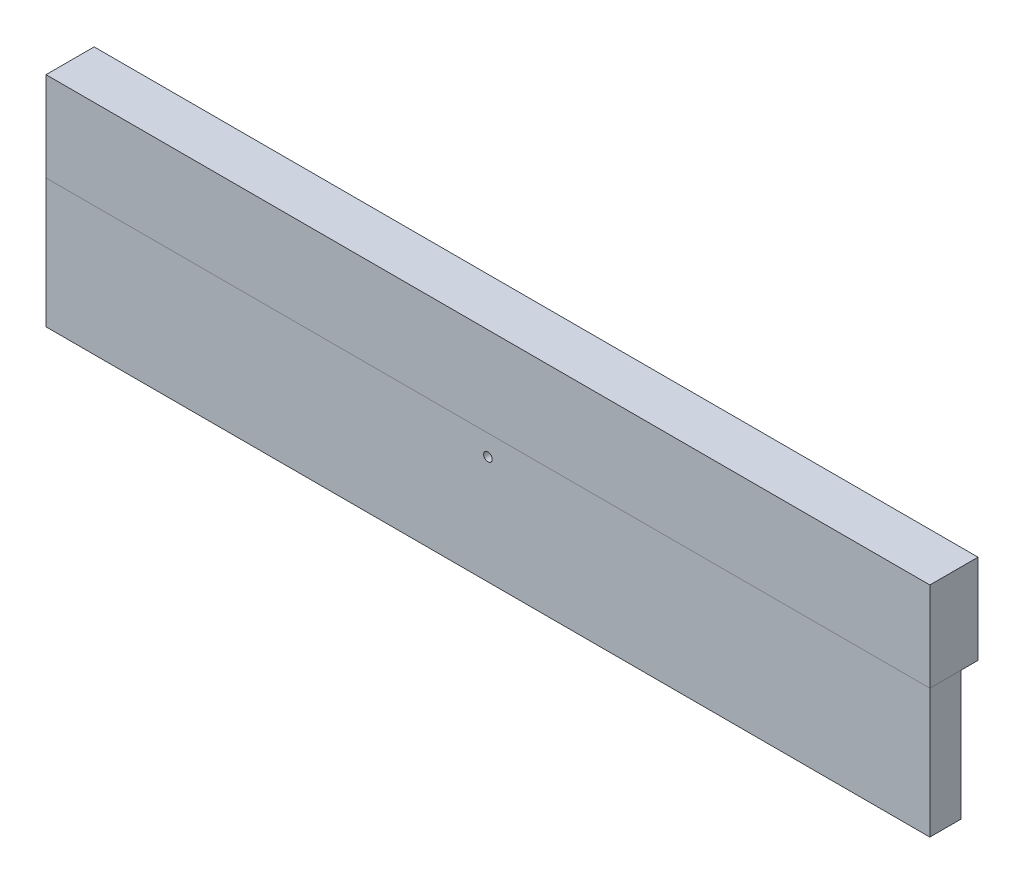
ISO-10303-21;
HEADER;
FILE_DESCRIPTION(('STEP AP214'),'2;1');
FILE_NAME('part.step','',(''),(''),'','','');
FILE_SCHEMA(('AUTOMOTIVE_DESIGN { 1 0 10303 214 1 1 1 1 }'));
ENDSEC;
DATA;
#1=APPLICATION_CONTEXT('core data for automotive mechanical design processes');
#2=APPLICATION_PROTOCOL_DEFINITION('international standard','automotive_design',2000,#1);
#3=PRODUCT_CONTEXT('',#1,'mechanical');
#4=PRODUCT('Part','Part','',(#3));
#5=PRODUCT_RELATED_PRODUCT_CATEGORY('part','',(#4));
#6=PRODUCT_DEFINITION_FORMATION('','',#4);
#7=PRODUCT_DEFINITION_CONTEXT('part definition',#1,'design');
#8=PRODUCT_DEFINITION('design','',#6,#7);
#9=PRODUCT_DEFINITION_SHAPE('','',#8);
#10=(LENGTH_UNIT() NAMED_UNIT(*) SI_UNIT(.MILLI.,.METRE.));
#11=(NAMED_UNIT(*) PLANE_ANGLE_UNIT() SI_UNIT($,.RADIAN.));
#12=(NAMED_UNIT(*) SI_UNIT($,.STERADIAN.) SOLID_ANGLE_UNIT());
#13=UNCERTAINTY_MEASURE_WITH_UNIT(LENGTH_MEASURE(1.E-05),#10,'distance_accuracy_value','');
#14=(GEOMETRIC_REPRESENTATION_CONTEXT(3) GLOBAL_UNCERTAINTY_ASSIGNED_CONTEXT((#13)) GLOBAL_UNIT_ASSIGNED_CONTEXT((#10,
#11,#12)) REPRESENTATION_CONTEXT('',''));
#15=CARTESIAN_POINT('',(0.,0.,0.));
#16=DIRECTION('',(0.,0.,1.));
#17=DIRECTION('',(1.,0.,0.));
#18=AXIS2_PLACEMENT_3D('',#15,#16,#17);
#19=CARTESIAN_POINT('',(0.,-37.5,9.));
#20=DIRECTION('',(0.,1.,0.));
#21=DIRECTION('',(0.,0.,1.));
#22=AXIS2_PLACEMENT_3D('',#19,#20,#21);
#23=PLANE('',#22);
#24=DIRECTION('',(1.,0.,0.));
#25=VECTOR('',#24,1.);
#26=CARTESIAN_POINT('',(0.,-37.5,-9.));
#27=LINE('',#26,#25);
#28=CARTESIAN_POINT('',(-257.,-37.5,-9.));
#29=VERTEX_POINT('',#28);
#30=CARTESIAN_POINT('',(257.,-37.5,-9.));
#31=VERTEX_POINT('',#30);
#32=EDGE_CURVE('E116',#29,#31,#27,.T.);
#33=ORIENTED_EDGE('',*,*,#32,.T.);
#34=DIRECTION('',(0.,0.,-1.));
#35=VECTOR('',#34,1.);
#36=CARTESIAN_POINT('',(257.,-37.5,9.));
#37=LINE('',#36,#35);
#38=CARTESIAN_POINT('',(257.,-37.5,9.));
#39=VERTEX_POINT('',#38);
#40=EDGE_CURVE('E12',#39,#31,#37,.T.);
#41=ORIENTED_EDGE('',*,*,#40,.F.);
#42=DIRECTION('',(1.,0.,0.));
#43=VECTOR('',#42,1.);
#44=CARTESIAN_POINT('',(0.,-37.5,9.));
#45=LINE('',#44,#43);
#46=CARTESIAN_POINT('',(-257.,-37.5,9.));
#47=VERTEX_POINT('',#46);
#48=EDGE_CURVE('E99',#47,#39,#45,.T.);
#49=ORIENTED_EDGE('',*,*,#48,.F.);
#50=DIRECTION('',(0.,0.,-1.));
#51=VECTOR('',#50,1.);
#52=CARTESIAN_POINT('',(-257.,-37.5,9.));
#53=LINE('',#52,#51);
#54=EDGE_CURVE('E66',#47,#29,#53,.T.);
#55=ORIENTED_EDGE('',*,*,#54,.T.);
#56=EDGE_LOOP('',(#33,#41,#49,#55));
#57=FACE_BOUND('',#56,.T.);
#58=ADVANCED_FACE('F49',(#57),#23,.F.);
#59=CARTESIAN_POINT('',(257.,0.,9.));
#60=DIRECTION('',(-1.,0.,0.));
#61=DIRECTION('',(0.,0.,1.));
#62=AXIS2_PLACEMENT_3D('',#59,#60,#61);
#63=PLANE('',#62);
#64=DIRECTION('',(0.,1.,0.));
#65=VECTOR('',#64,1.);
#66=CARTESIAN_POINT('',(257.,0.,-9.));
#67=LINE('',#66,#65);
#68=CARTESIAN_POINT('',(257.,37.5,-9.));
#69=VERTEX_POINT('',#68);
#70=EDGE_CURVE('E104',#31,#69,#67,.T.);
#71=ORIENTED_EDGE('',*,*,#70,.T.);
#72=DIRECTION('',(0.,0.,-1.));
#73=VECTOR('',#72,1.);
#74=CARTESIAN_POINT('',(257.,37.5,9.));
#75=LINE('',#74,#73);
#76=CARTESIAN_POINT('',(257.,37.5,9.));
#77=VERTEX_POINT('',#76);
#78=EDGE_CURVE('E58',#77,#69,#75,.T.);
#79=ORIENTED_EDGE('',*,*,#78,.F.);
#80=DIRECTION('',(0.,1.,0.));
#81=VECTOR('',#80,1.);
#82=CARTESIAN_POINT('',(257.,0.,9.));
#83=LINE('',#82,#81);
#84=EDGE_CURVE('E91',#39,#77,#83,.T.);
#85=ORIENTED_EDGE('',*,*,#84,.F.);
#86=ORIENTED_EDGE('',*,*,#40,.T.);
#87=EDGE_LOOP('',(#71,#79,#85,#86));
#88=FACE_BOUND('',#87,.T.);
#89=ADVANCED_FACE('F103',(#88),#63,.F.);
#90=CARTESIAN_POINT('',(0.,37.5,9.));
#91=DIRECTION('',(0.,1.,0.));
#92=DIRECTION('',(-1.,0.,0.));
#93=AXIS2_PLACEMENT_3D('',#90,#91,#92);
#94=PLANE('',#93);
#95=DIRECTION('',(1.,0.,0.));
#96=VECTOR('',#95,1.);
#97=CARTESIAN_POINT('',(0.,37.5,-9.));
#98=LINE('',#97,#96);
#99=CARTESIAN_POINT('',(-257.,37.5,-9.));
#100=VERTEX_POINT('',#99);
#101=EDGE_CURVE('E119',#100,#69,#98,.T.);
#102=ORIENTED_EDGE('',*,*,#101,.F.);
#103=DIRECTION('',(0.,0.,-1.));
#104=VECTOR('',#103,1.);
#105=CARTESIAN_POINT('',(-257.,37.5,9.));
#106=LINE('',#105,#104);
#107=CARTESIAN_POINT('',(-257.,37.5,9.));
#108=VERTEX_POINT('',#107);
#109=EDGE_CURVE('E80',#108,#100,#106,.T.);
#110=ORIENTED_EDGE('',*,*,#109,.F.);
#111=DIRECTION('',(1.,0.,0.));
#112=VECTOR('',#111,1.);
#113=CARTESIAN_POINT('',(0.,37.5,9.));
#114=LINE('',#113,#112);
#115=EDGE_CURVE('E98',#108,#77,#114,.T.);
#116=ORIENTED_EDGE('',*,*,#115,.T.);
#117=ORIENTED_EDGE('',*,*,#78,.T.);
#118=EDGE_LOOP('',(#102,#110,#116,#117));
#119=FACE_BOUND('',#118,.T.);
#120=ADVANCED_FACE('F107',(#119),#94,.T.);
#121=CARTESIAN_POINT('',(0.,25.5,9.));
#122=DIRECTION('',(0.,0.,-1.));
#123=DIRECTION('',(-1.,0.,0.));
#124=AXIS2_PLACEMENT_3D('',#121,#122,#123);
#125=CYLINDRICAL_SURFACE('',#124,2.5);
#126=CARTESIAN_POINT('',(0.,25.5,9.));
#127=DIRECTION('',(0.,0.,1.));
#128=DIRECTION('',(1.,0.,0.));
#129=AXIS2_PLACEMENT_3D('',#126,#127,#128);
#130=CIRCLE('',#129,2.5);
#131=CARTESIAN_POINT('',(2.5,25.5,9.));
#132=VERTEX_POINT('',#131);
#133=EDGE_CURVE('E124',#132,#132,#130,.T.);
#134=ORIENTED_EDGE('',*,*,#133,.T.);
#135=EDGE_LOOP('',(#134));
#136=FACE_BOUND('',#135,.T.);
#137=CARTESIAN_POINT('',(0.,25.5,-9.));
#138=DIRECTION('',(0.,0.,1.));
#139=DIRECTION('',(1.,0.,0.));
#140=AXIS2_PLACEMENT_3D('',#137,#138,#139);
#141=CIRCLE('',#140,2.5);
#142=CARTESIAN_POINT('',(2.5,25.5,-9.));
#143=VERTEX_POINT('',#142);
#144=EDGE_CURVE('E113',#143,#143,#141,.T.);
#145=ORIENTED_EDGE('',*,*,#144,.F.);
#146=EDGE_LOOP('',(#145));
#147=FACE_BOUND('',#146,.T.);
#148=ADVANCED_FACE('F51',(#136,#147),#125,.F.);
#149=CARTESIAN_POINT('',(-257.,0.,9.));
#150=DIRECTION('',(-1.,0.,0.));
#151=DIRECTION('',(0.,0.,1.));
#152=AXIS2_PLACEMENT_3D('',#149,#150,#151);
#153=PLANE('',#152);
#154=DIRECTION('',(0.,1.,0.));
#155=VECTOR('',#154,1.);
#156=CARTESIAN_POINT('',(-257.,0.,-9.));
#157=LINE('',#156,#155);
#158=EDGE_CURVE('E121',#29,#100,#157,.T.);
#159=ORIENTED_EDGE('',*,*,#158,.F.);
#160=ORIENTED_EDGE('',*,*,#54,.F.);
#161=DIRECTION('',(0.,1.,0.));
#162=VECTOR('',#161,1.);
#163=CARTESIAN_POINT('',(-257.,0.,9.));
#164=LINE('',#163,#162);
#165=EDGE_CURVE('E108',#47,#108,#164,.T.);
#166=ORIENTED_EDGE('',*,*,#165,.T.);
#167=ORIENTED_EDGE('',*,*,#109,.T.);
#168=EDGE_LOOP('',(#159,#160,#166,#167));
#169=FACE_BOUND('',#168,.T.);
#170=ADVANCED_FACE('F135',(#169),#153,.T.);
#171=CARTESIAN_POINT('',(0.,0.,9.));
#172=DIRECTION('',(0.,0.,1.));
#173=DIRECTION('',(1.,0.,0.));
#174=AXIS2_PLACEMENT_3D('',#171,#172,#173);
#175=PLANE('',#174);
#176=ORIENTED_EDGE('',*,*,#133,.F.);
#177=EDGE_LOOP('',(#176));
#178=FACE_BOUND('',#177,.T.);
#179=ORIENTED_EDGE('',*,*,#48,.T.);
#180=ORIENTED_EDGE('',*,*,#84,.T.);
#181=ORIENTED_EDGE('',*,*,#115,.F.);
#182=ORIENTED_EDGE('',*,*,#165,.F.);
#183=EDGE_LOOP('',(#179,#180,#181,#182));
#184=FACE_BOUND('',#183,.T.);
#185=ADVANCED_FACE('F95',(#178,#184),#175,.T.);
#186=CARTESIAN_POINT('',(0.,0.,-9.));
#187=DIRECTION('',(0.,0.,1.));
#188=DIRECTION('',(1.,0.,0.));
#189=AXIS2_PLACEMENT_3D('',#186,#187,#188);
#190=PLANE('',#189);
#191=ORIENTED_EDGE('',*,*,#144,.T.);
#192=EDGE_LOOP('',(#191));
#193=FACE_BOUND('',#192,.T.);
#194=ORIENTED_EDGE('',*,*,#32,.F.);
#195=ORIENTED_EDGE('',*,*,#158,.T.);
#196=ORIENTED_EDGE('',*,*,#101,.T.);
#197=ORIENTED_EDGE('',*,*,#70,.F.);
#198=EDGE_LOOP('',(#194,#195,#196,#197));
#199=FACE_BOUND('',#198,.T.);
#200=ADVANCED_FACE('F134',(#193,#199),#190,.F.);
#201=CLOSED_SHELL('',(#58,#89,#120,#148,#170,#185,#200));
#202=MANIFOLD_SOLID_BREP('B2',#201);
#203=CARTESIAN_POINT('',(0.,89.5,9.));
#204=DIRECTION('',(0.,-1.,0.));
#205=DIRECTION('',(1.,0.,0.));
#206=AXIS2_PLACEMENT_3D('',#203,#204,#205);
#207=PLANE('',#206);
#208=DIRECTION('',(0.,0.,-1.));
#209=VECTOR('',#208,1.);
#210=CARTESIAN_POINT('',(257.,89.5000000000001,9.));
#211=LINE('',#210,#209);
#212=CARTESIAN_POINT('',(257.,89.5000000000001,9.));
#213=VERTEX_POINT('',#212);
#214=CARTESIAN_POINT('',(257.,89.5000000000001,-19.));
#215=VERTEX_POINT('',#214);
#216=EDGE_CURVE('E211',#213,#215,#211,.T.);
#217=ORIENTED_EDGE('',*,*,#216,.T.);
#218=DIRECTION('',(-1.,0.,0.));
#219=VECTOR('',#218,1.);
#220=CARTESIAN_POINT('',(0.,89.5,-19.));
#221=LINE('',#220,#219);
#222=CARTESIAN_POINT('',(-257.,89.5,-19.));
#223=VERTEX_POINT('',#222);
#224=EDGE_CURVE('E251',#215,#223,#221,.T.);
#225=ORIENTED_EDGE('',*,*,#224,.T.);
#226=DIRECTION('',(0.,0.,-1.));
#227=VECTOR('',#226,1.);
#228=CARTESIAN_POINT('',(-257.,89.5,9.));
#229=LINE('',#228,#227);
#230=CARTESIAN_POINT('',(-257.,89.5,9.));
#231=VERTEX_POINT('',#230);
#232=EDGE_CURVE('E47',#231,#223,#229,.T.);
#233=ORIENTED_EDGE('',*,*,#232,.F.);
#234=DIRECTION('',(-1.,0.,0.));
#235=VECTOR('',#234,1.);
#236=CARTESIAN_POINT('',(0.,89.5,9.));
#237=LINE('',#236,#235);
#238=EDGE_CURVE('E260',#213,#231,#237,.T.);
#239=ORIENTED_EDGE('',*,*,#238,.F.);
#240=EDGE_LOOP('',(#217,#225,#233,#239));
#241=FACE_BOUND('',#240,.T.);
#242=ADVANCED_FACE('F197',(#241),#207,.F.);
#243=CARTESIAN_POINT('',(-257.,0.,9.));
#244=DIRECTION('',(1.,0.,0.));
#245=DIRECTION('',(0.,0.,-1.));
#246=AXIS2_PLACEMENT_3D('',#243,#244,#245);
#247=PLANE('',#246);
#248=ORIENTED_EDGE('',*,*,#232,.T.);
#249=DIRECTION('',(0.,-1.,0.));
#250=VECTOR('',#249,1.);
#251=CARTESIAN_POINT('',(-257.,0.,-19.));
#252=LINE('',#251,#250);
#253=CARTESIAN_POINT('',(-257.,37.5,-19.));
#254=VERTEX_POINT('',#253);
#255=EDGE_CURVE('E255',#223,#254,#252,.T.);
#256=ORIENTED_EDGE('',*,*,#255,.T.);
#257=DIRECTION('',(0.,0.,-1.));
#258=VECTOR('',#257,1.);
#259=CARTESIAN_POINT('',(-257.,37.5,9.));
#260=LINE('',#259,#258);
#261=CARTESIAN_POINT('',(-257.,37.5,9.));
#262=VERTEX_POINT('',#261);
#263=EDGE_CURVE('E204',#262,#254,#260,.T.);
#264=ORIENTED_EDGE('',*,*,#263,.F.);
#265=DIRECTION('',(0.,-1.,0.));
#266=VECTOR('',#265,1.);
#267=CARTESIAN_POINT('',(-257.,0.,9.));
#268=LINE('',#267,#266);
#269=EDGE_CURVE('E263',#231,#262,#268,.T.);
#270=ORIENTED_EDGE('',*,*,#269,.F.);
#271=EDGE_LOOP('',(#248,#256,#264,#270));
#272=FACE_BOUND('',#271,.T.);
#273=ADVANCED_FACE('F279',(#272),#247,.F.);
#274=CARTESIAN_POINT('',(0.,37.5,9.));
#275=DIRECTION('',(0.,1.,0.));
#276=DIRECTION('',(-1.,0.,0.));
#277=AXIS2_PLACEMENT_3D('',#274,#275,#276);
#278=PLANE('',#277);
#279=ORIENTED_EDGE('',*,*,#263,.T.);
#280=DIRECTION('',(1.,0.,0.));
#281=VECTOR('',#280,1.);
#282=CARTESIAN_POINT('',(0.,37.5,-19.));
#283=LINE('',#282,#281);
#284=CARTESIAN_POINT('',(257.,37.5,-19.));
#285=VERTEX_POINT('',#284);
#286=EDGE_CURVE('E248',#254,#285,#283,.T.);
#287=ORIENTED_EDGE('',*,*,#286,.T.);
#288=DIRECTION('',(0.,0.,-1.));
#289=VECTOR('',#288,1.);
#290=CARTESIAN_POINT('',(257.,37.5,9.));
#291=LINE('',#290,#289);
#292=CARTESIAN_POINT('',(257.,37.5,9.));
#293=VERTEX_POINT('',#292);
#294=EDGE_CURVE('E235',#293,#285,#291,.T.);
#295=ORIENTED_EDGE('',*,*,#294,.F.);
#296=DIRECTION('',(1.,0.,0.));
#297=VECTOR('',#296,1.);
#298=CARTESIAN_POINT('',(0.,37.5,9.));
#299=LINE('',#298,#297);
#300=EDGE_CURVE('E219',#262,#293,#299,.T.);
#301=ORIENTED_EDGE('',*,*,#300,.F.);
#302=EDGE_LOOP('',(#279,#287,#295,#301));
#303=FACE_BOUND('',#302,.T.);
#304=ADVANCED_FACE('F253',(#303),#278,.F.);
#305=CARTESIAN_POINT('',(257.,0.,9.));
#306=DIRECTION('',(1.,0.,0.));
#307=DIRECTION('',(0.,0.,-1.));
#308=AXIS2_PLACEMENT_3D('',#305,#306,#307);
#309=PLANE('',#308);
#310=ORIENTED_EDGE('',*,*,#294,.T.);
#311=DIRECTION('',(0.,-1.,0.));
#312=VECTOR('',#311,1.);
#313=CARTESIAN_POINT('',(257.,0.,-19.));
#314=LINE('',#313,#312);
#315=EDGE_CURVE('E238',#215,#285,#314,.T.);
#316=ORIENTED_EDGE('',*,*,#315,.F.);
#317=ORIENTED_EDGE('',*,*,#216,.F.);
#318=DIRECTION('',(0.,-1.,0.));
#319=VECTOR('',#318,1.);
#320=CARTESIAN_POINT('',(257.,0.,9.));
#321=LINE('',#320,#319);
#322=EDGE_CURVE('E240',#213,#293,#321,.T.);
#323=ORIENTED_EDGE('',*,*,#322,.T.);
#324=EDGE_LOOP('',(#310,#316,#317,#323));
#325=FACE_BOUND('',#324,.T.);
#326=ADVANCED_FACE('F237',(#325),#309,.T.);
#327=CARTESIAN_POINT('',(0.,0.,9.));
#328=DIRECTION('',(0.,0.,1.));
#329=DIRECTION('',(1.,0.,0.));
#330=AXIS2_PLACEMENT_3D('',#327,#328,#329);
#331=PLANE('',#330);
#332=ORIENTED_EDGE('',*,*,#238,.T.);
#333=ORIENTED_EDGE('',*,*,#269,.T.);
#334=ORIENTED_EDGE('',*,*,#300,.T.);
#335=ORIENTED_EDGE('',*,*,#322,.F.);
#336=EDGE_LOOP('',(#332,#333,#334,#335));
#337=FACE_BOUND('',#336,.T.);
#338=ADVANCED_FACE('F269',(#337),#331,.T.);
#339=CARTESIAN_POINT('',(0.,0.,-19.));
#340=DIRECTION('',(0.,0.,1.));
#341=DIRECTION('',(1.,0.,0.));
#342=AXIS2_PLACEMENT_3D('',#339,#340,#341);
#343=PLANE('',#342);
#344=ORIENTED_EDGE('',*,*,#315,.T.);
#345=ORIENTED_EDGE('',*,*,#286,.F.);
#346=ORIENTED_EDGE('',*,*,#255,.F.);
#347=ORIENTED_EDGE('',*,*,#224,.F.);
#348=EDGE_LOOP('',(#344,#345,#346,#347));
#349=FACE_BOUND('',#348,.T.);
#350=ADVANCED_FACE('F246',(#349),#343,.F.);
#351=CLOSED_SHELL('',(#242,#273,#304,#326,#338,#350));
#352=MANIFOLD_SOLID_BREP('B6',#351);
#353=ADVANCED_BREP_SHAPE_REPRESENTATION('',(#18,#202,#352),#14);
#354=SHAPE_DEFINITION_REPRESENTATION(#9,#353);
ENDSEC;
END-ISO-10303-21;
